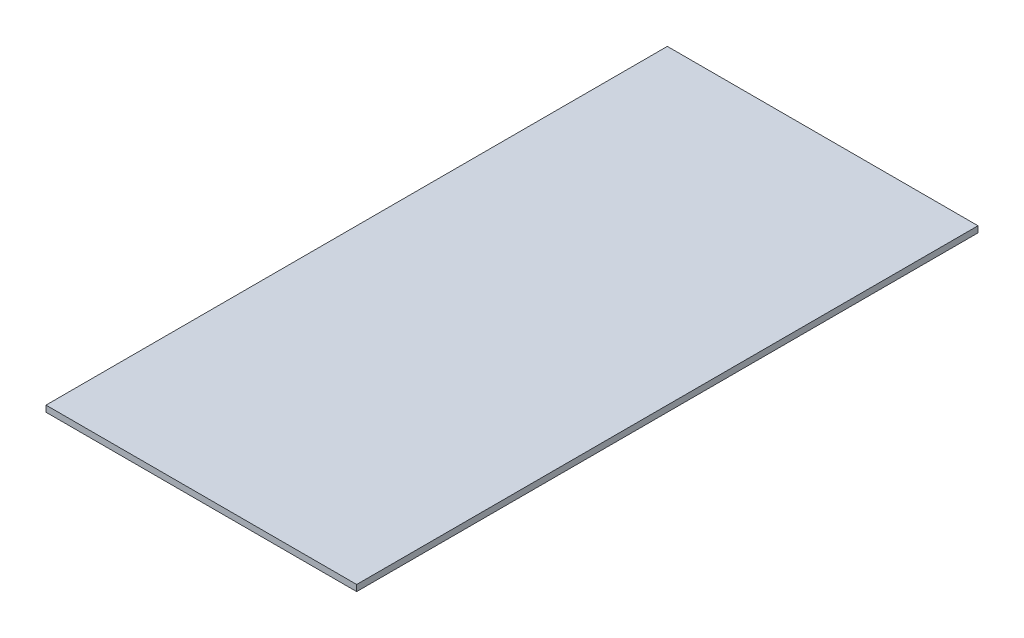
ISO-10303-21;
HEADER;
FILE_DESCRIPTION(('STEP AP214'),'2;1');
FILE_NAME('part.step','',(''),(''),'','','');
FILE_SCHEMA(('AUTOMOTIVE_DESIGN { 1 0 10303 214 1 1 1 1 }'));
ENDSEC;
DATA;
#1=APPLICATION_CONTEXT('core data for automotive mechanical design processes');
#2=APPLICATION_PROTOCOL_DEFINITION('international standard','automotive_design',2000,#1);
#3=PRODUCT_CONTEXT('',#1,'mechanical');
#4=PRODUCT('Part','Part','',(#3));
#5=PRODUCT_RELATED_PRODUCT_CATEGORY('part','',(#4));
#6=PRODUCT_DEFINITION_FORMATION('','',#4);
#7=PRODUCT_DEFINITION_CONTEXT('part definition',#1,'design');
#8=PRODUCT_DEFINITION('design','',#6,#7);
#9=PRODUCT_DEFINITION_SHAPE('','',#8);
#10=(LENGTH_UNIT() NAMED_UNIT(*) SI_UNIT(.MILLI.,.METRE.));
#11=(NAMED_UNIT(*) PLANE_ANGLE_UNIT() SI_UNIT($,.RADIAN.));
#12=(NAMED_UNIT(*) SI_UNIT($,.STERADIAN.) SOLID_ANGLE_UNIT());
#13=UNCERTAINTY_MEASURE_WITH_UNIT(LENGTH_MEASURE(1.E-05),#10,'distance_accuracy_value','');
#14=(GEOMETRIC_REPRESENTATION_CONTEXT(3) GLOBAL_UNCERTAINTY_ASSIGNED_CONTEXT((#13)) GLOBAL_UNIT_ASSIGNED_CONTEXT((#10,
#11,#12)) REPRESENTATION_CONTEXT('',''));
#15=CARTESIAN_POINT('',(0.,0.,0.));
#16=DIRECTION('',(0.,0.,1.));
#17=DIRECTION('',(1.,0.,0.));
#18=AXIS2_PLACEMENT_3D('',#15,#16,#17);
#19=CARTESIAN_POINT('',(-5209.09090909091,6.,-2795.45454545455));
#20=DIRECTION('',(1.,0.,0.));
#21=DIRECTION('',(0.,0.,-1.));
#22=AXIS2_PLACEMENT_3D('',#19,#20,#21);
#23=PLANE('',#22);
#24=DIRECTION('',(0.,0.,1.));
#25=VECTOR('',#24,1.);
#26=CARTESIAN_POINT('',(-5209.09090909091,0.,-2795.45454545455));
#27=LINE('',#26,#25);
#28=CARTESIAN_POINT('',(-5209.09090909091,0.,-2795.45454545455));
#29=VERTEX_POINT('',#28);
#30=CARTESIAN_POINT('',(-5209.09090909091,0.,-2195.45454545455));
#31=VERTEX_POINT('',#30);
#32=EDGE_CURVE('E97',#29,#31,#27,.T.);
#33=ORIENTED_EDGE('',*,*,#32,.T.);
#34=DIRECTION('',(0.,-1.,0.));
#35=VECTOR('',#34,1.);
#36=CARTESIAN_POINT('',(-5209.09090909091,6.,-2195.45454545455));
#37=LINE('',#36,#35);
#38=CARTESIAN_POINT('',(-5209.09090909091,6.,-2195.45454545455));
#39=VERTEX_POINT('',#38);
#40=EDGE_CURVE('E11',#39,#31,#37,.T.);
#41=ORIENTED_EDGE('',*,*,#40,.F.);
#42=DIRECTION('',(0.,0.,1.));
#43=VECTOR('',#42,1.);
#44=CARTESIAN_POINT('',(-5209.09090909091,6.,-2795.45454545455));
#45=LINE('',#44,#43);
#46=CARTESIAN_POINT('',(-5209.09090909091,6.,-2795.45454545455));
#47=VERTEX_POINT('',#46);
#48=EDGE_CURVE('E85',#47,#39,#45,.T.);
#49=ORIENTED_EDGE('',*,*,#48,.F.);
#50=DIRECTION('',(0.,-1.,0.));
#51=VECTOR('',#50,1.);
#52=CARTESIAN_POINT('',(-5209.09090909091,6.,-2795.45454545455));
#53=LINE('',#52,#51);
#54=EDGE_CURVE('E93',#47,#29,#53,.T.);
#55=ORIENTED_EDGE('',*,*,#54,.T.);
#56=EDGE_LOOP('',(#33,#41,#49,#55));
#57=FACE_BOUND('',#56,.T.);
#58=ADVANCED_FACE('F34',(#57),#23,.F.);
#59=CARTESIAN_POINT('',(-5209.09090909091,6.,-2195.45454545455));
#60=DIRECTION('',(0.,0.,-1.));
#61=DIRECTION('',(-1.,0.,0.));
#62=AXIS2_PLACEMENT_3D('',#59,#60,#61);
#63=PLANE('',#62);
#64=DIRECTION('',(1.,0.,0.));
#65=VECTOR('',#64,1.);
#66=CARTESIAN_POINT('',(-5209.09090909091,0.,-2195.45454545455));
#67=LINE('',#66,#65);
#68=CARTESIAN_POINT('',(-4909.09090909091,0.,-2195.45454545455));
#69=VERTEX_POINT('',#68);
#70=EDGE_CURVE('E89',#31,#69,#67,.T.);
#71=ORIENTED_EDGE('',*,*,#70,.T.);
#72=DIRECTION('',(0.,-1.,0.));
#73=VECTOR('',#72,1.);
#74=CARTESIAN_POINT('',(-4909.09090909091,6.,-2195.45454545455));
#75=LINE('',#74,#73);
#76=CARTESIAN_POINT('',(-4909.09090909091,6.,-2195.45454545455));
#77=VERTEX_POINT('',#76);
#78=EDGE_CURVE('E42',#77,#69,#75,.T.);
#79=ORIENTED_EDGE('',*,*,#78,.F.);
#80=DIRECTION('',(1.,0.,0.));
#81=VECTOR('',#80,1.);
#82=CARTESIAN_POINT('',(-5209.09090909091,6.,-2195.45454545455));
#83=LINE('',#82,#81);
#84=EDGE_CURVE('E80',#39,#77,#83,.T.);
#85=ORIENTED_EDGE('',*,*,#84,.F.);
#86=ORIENTED_EDGE('',*,*,#40,.T.);
#87=EDGE_LOOP('',(#71,#79,#85,#86));
#88=FACE_BOUND('',#87,.T.);
#89=ADVANCED_FACE('F88',(#88),#63,.F.);
#90=CARTESIAN_POINT('',(-4909.09090909091,6.,-2795.45454545455));
#91=DIRECTION('',(-1.,0.,0.));
#92=DIRECTION('',(0.,0.,1.));
#93=AXIS2_PLACEMENT_3D('',#90,#91,#92);
#94=PLANE('',#93);
#95=DIRECTION('',(0.,0.,-1.));
#96=VECTOR('',#95,1.);
#97=CARTESIAN_POINT('',(-4909.09090909091,0.,-2795.45454545455));
#98=LINE('',#97,#96);
#99=CARTESIAN_POINT('',(-4909.09090909091,0.,-2795.45454545455));
#100=VERTEX_POINT('',#99);
#101=EDGE_CURVE('E67',#69,#100,#98,.T.);
#102=ORIENTED_EDGE('',*,*,#101,.T.);
#103=DIRECTION('',(0.,-1.,0.));
#104=VECTOR('',#103,1.);
#105=CARTESIAN_POINT('',(-4909.09090909091,6.,-2795.45454545455));
#106=LINE('',#105,#104);
#107=CARTESIAN_POINT('',(-4909.09090909091,6.,-2795.45454545455));
#108=VERTEX_POINT('',#107);
#109=EDGE_CURVE('E90',#108,#100,#106,.T.);
#110=ORIENTED_EDGE('',*,*,#109,.F.);
#111=DIRECTION('',(0.,0.,-1.));
#112=VECTOR('',#111,1.);
#113=CARTESIAN_POINT('',(-4909.09090909091,6.,-2795.45454545455));
#114=LINE('',#113,#112);
#115=EDGE_CURVE('E83',#77,#108,#114,.T.);
#116=ORIENTED_EDGE('',*,*,#115,.F.);
#117=ORIENTED_EDGE('',*,*,#78,.T.);
#118=EDGE_LOOP('',(#102,#110,#116,#117));
#119=FACE_BOUND('',#118,.T.);
#120=ADVANCED_FACE('F91',(#119),#94,.F.);
#121=CARTESIAN_POINT('',(-5209.09090909091,6.,-2795.45454545455));
#122=DIRECTION('',(0.,0.,1.));
#123=DIRECTION('',(1.,0.,0.));
#124=AXIS2_PLACEMENT_3D('',#121,#122,#123);
#125=PLANE('',#124);
#126=DIRECTION('',(-1.,0.,0.));
#127=VECTOR('',#126,1.);
#128=CARTESIAN_POINT('',(-5209.09090909091,0.,-2795.45454545455));
#129=LINE('',#128,#127);
#130=EDGE_CURVE('E73',#100,#29,#129,.T.);
#131=ORIENTED_EDGE('',*,*,#130,.T.);
#132=ORIENTED_EDGE('',*,*,#54,.F.);
#133=DIRECTION('',(-1.,0.,0.));
#134=VECTOR('',#133,1.);
#135=CARTESIAN_POINT('',(-5209.09090909091,6.,-2795.45454545455));
#136=LINE('',#135,#134);
#137=EDGE_CURVE('E50',#108,#47,#136,.T.);
#138=ORIENTED_EDGE('',*,*,#137,.F.);
#139=ORIENTED_EDGE('',*,*,#109,.T.);
#140=EDGE_LOOP('',(#131,#132,#138,#139));
#141=FACE_BOUND('',#140,.T.);
#142=ADVANCED_FACE('F104',(#141),#125,.F.);
#143=CARTESIAN_POINT('',(0.,6.,0.));
#144=DIRECTION('',(0.,1.,0.));
#145=DIRECTION('',(0.,0.,1.));
#146=AXIS2_PLACEMENT_3D('',#143,#144,#145);
#147=PLANE('',#146);
#148=ORIENTED_EDGE('',*,*,#48,.T.);
#149=ORIENTED_EDGE('',*,*,#84,.T.);
#150=ORIENTED_EDGE('',*,*,#115,.T.);
#151=ORIENTED_EDGE('',*,*,#137,.T.);
#152=EDGE_LOOP('',(#148,#149,#150,#151));
#153=FACE_BOUND('',#152,.T.);
#154=ADVANCED_FACE('F81',(#153),#147,.T.);
#155=CARTESIAN_POINT('',(0.,0.,0.));
#156=DIRECTION('',(0.,1.,0.));
#157=DIRECTION('',(0.,0.,1.));
#158=AXIS2_PLACEMENT_3D('',#155,#156,#157);
#159=PLANE('',#158);
#160=ORIENTED_EDGE('',*,*,#32,.F.);
#161=ORIENTED_EDGE('',*,*,#130,.F.);
#162=ORIENTED_EDGE('',*,*,#101,.F.);
#163=ORIENTED_EDGE('',*,*,#70,.F.);
#164=EDGE_LOOP('',(#160,#161,#162,#163));
#165=FACE_BOUND('',#164,.T.);
#166=ADVANCED_FACE('F107',(#165),#159,.F.);
#167=CLOSED_SHELL('',(#58,#89,#120,#142,#154,#166));
#168=MANIFOLD_SOLID_BREP('B2',#167);
#169=ADVANCED_BREP_SHAPE_REPRESENTATION('',(#18,#168),#14);
#170=SHAPE_DEFINITION_REPRESENTATION(#9,#169);
ENDSEC;
END-ISO-10303-21;
